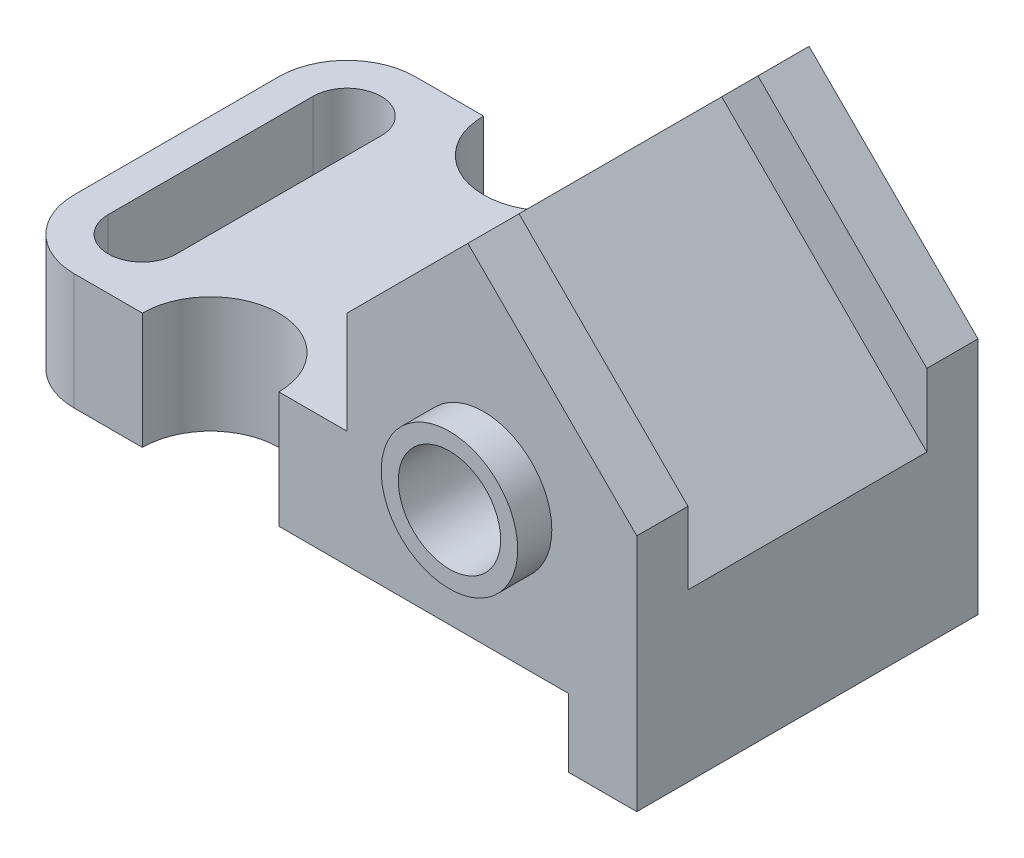
ISO-10303-21;
HEADER;
FILE_DESCRIPTION(('STEP AP214'),'2;1');
FILE_NAME('part.step','',(''),(''),'','','');
FILE_SCHEMA(('AUTOMOTIVE_DESIGN { 1 0 10303 214 1 1 1 1 }'));
ENDSEC;
DATA;
#1=APPLICATION_CONTEXT('core data for automotive mechanical design processes');
#2=APPLICATION_PROTOCOL_DEFINITION('international standard','automotive_design',2000,#1);
#3=PRODUCT_CONTEXT('',#1,'mechanical');
#4=PRODUCT('Part','Part','',(#3));
#5=PRODUCT_RELATED_PRODUCT_CATEGORY('part','',(#4));
#6=PRODUCT_DEFINITION_FORMATION('','',#4);
#7=PRODUCT_DEFINITION_CONTEXT('part definition',#1,'design');
#8=PRODUCT_DEFINITION('design','',#6,#7);
#9=PRODUCT_DEFINITION_SHAPE('','',#8);
#10=(LENGTH_UNIT() NAMED_UNIT(*) SI_UNIT(.MILLI.,.METRE.));
#11=(NAMED_UNIT(*) PLANE_ANGLE_UNIT() SI_UNIT($,.RADIAN.));
#12=(NAMED_UNIT(*) SI_UNIT($,.STERADIAN.) SOLID_ANGLE_UNIT());
#13=UNCERTAINTY_MEASURE_WITH_UNIT(LENGTH_MEASURE(1.E-05),#10,'distance_accuracy_value','');
#14=(GEOMETRIC_REPRESENTATION_CONTEXT(3) GLOBAL_UNCERTAINTY_ASSIGNED_CONTEXT((#13)) GLOBAL_UNIT_ASSIGNED_CONTEXT((#10,
#11,#12)) REPRESENTATION_CONTEXT('',''));
#15=CARTESIAN_POINT('',(0.,0.,0.));
#16=DIRECTION('',(0.,0.,1.));
#17=DIRECTION('',(1.,0.,0.));
#18=AXIS2_PLACEMENT_3D('',#15,#16,#17);
#19=CARTESIAN_POINT('',(0.,0.,100.));
#20=DIRECTION('',(0.,0.,1.));
#21=DIRECTION('',(1.,0.,0.));
#22=AXIS2_PLACEMENT_3D('',#19,#20,#21);
#23=PLANE('',#22);
#24=CARTESIAN_POINT('',(140.,39.1,100.));
#25=DIRECTION('',(0.,0.,1.));
#26=DIRECTION('',(1.,0.,0.));
#27=AXIS2_PLACEMENT_3D('',#24,#25,#26);
#28=CIRCLE('',#27,20.);
#29=CARTESIAN_POINT('',(160.,39.1,100.));
#30=VERTEX_POINT('',#29);
#31=EDGE_CURVE('E611',#30,#30,#28,.T.);
#32=ORIENTED_EDGE('',*,*,#31,.F.);
#33=EDGE_LOOP('',(#32));
#34=FACE_BOUND('',#33,.T.);
#35=DIRECTION('',(0.,1.,0.));
#36=VECTOR('',#35,1.);
#37=CARTESIAN_POINT('',(80.,-20.,100.));
#38=LINE('',#37,#36);
#39=CARTESIAN_POINT('',(80.,0.,100.));
#40=VERTEX_POINT('',#39);
#41=CARTESIAN_POINT('',(80.,34.1,100.));
#42=VERTEX_POINT('',#41);
#43=EDGE_CURVE('E407',#40,#42,#38,.T.);
#44=ORIENTED_EDGE('',*,*,#43,.F.);
#45=DIRECTION('',(1.,0.,0.));
#46=VECTOR('',#45,1.);
#47=CARTESIAN_POINT('',(0.,0.,100.));
#48=LINE('',#47,#46);
#49=CARTESIAN_POINT('',(164.9,0.,100.));
#50=VERTEX_POINT('',#49);
#51=EDGE_CURVE('E288',#40,#50,#48,.T.);
#52=ORIENTED_EDGE('',*,*,#51,.T.);
#53=DIRECTION('',(0.,-1.,0.));
#54=VECTOR('',#53,1.);
#55=CARTESIAN_POINT('',(164.9,0.,100.));
#56=LINE('',#55,#54);
#57=CARTESIAN_POINT('',(164.9,-20.,100.));
#58=VERTEX_POINT('',#57);
#59=EDGE_CURVE('E293',#50,#58,#56,.T.);
#60=ORIENTED_EDGE('',*,*,#59,.T.);
#61=DIRECTION('',(-1.,0.,0.));
#62=VECTOR('',#61,1.);
#63=CARTESIAN_POINT('',(0.,-20.,100.));
#64=LINE('',#63,#62);
#65=CARTESIAN_POINT('',(184.9,-20.,100.));
#66=VERTEX_POINT('',#65);
#67=EDGE_CURVE('E296',#66,#58,#64,.T.);
#68=ORIENTED_EDGE('',*,*,#67,.F.);
#69=DIRECTION('',(0.,1.,0.));
#70=VECTOR('',#69,1.);
#71=CARTESIAN_POINT('',(184.9,0.,100.));
#72=LINE('',#71,#70);
#73=CARTESIAN_POINT('',(184.9,50.,100.));
#74=VERTEX_POINT('',#73);
#75=EDGE_CURVE('E300',#66,#74,#72,.T.);
#76=ORIENTED_EDGE('',*,*,#75,.T.);
#77=DIRECTION('',(-0.70710678118655,0.707106781186546,0.));
#78=VECTOR('',#77,1.);
#79=CARTESIAN_POINT('',(117.45,117.45,100.));
#80=LINE('',#79,#78);
#81=CARTESIAN_POINT('',(135.4,99.5000000000001,100.));
#82=VERTEX_POINT('',#81);
#83=EDGE_CURVE('E304',#74,#82,#80,.T.);
#84=ORIENTED_EDGE('',*,*,#83,.T.);
#85=DIRECTION('',(-0.707106781186543,-0.707106781186552,0.));
#86=VECTOR('',#85,1.);
#87=CARTESIAN_POINT('',(17.9500000000006,-17.9500000000004,100.));
#88=LINE('',#87,#86);
#89=CARTESIAN_POINT('',(100.,64.1,100.));
#90=VERTEX_POINT('',#89);
#91=EDGE_CURVE('E308',#82,#90,#88,.T.);
#92=ORIENTED_EDGE('',*,*,#91,.T.);
#93=DIRECTION('',(0.,1.,0.));
#94=VECTOR('',#93,1.);
#95=CARTESIAN_POINT('',(100.,0.,100.));
#96=LINE('',#95,#94);
#97=CARTESIAN_POINT('',(100.,34.1,100.));
#98=VERTEX_POINT('',#97);
#99=EDGE_CURVE('E311',#98,#90,#96,.T.);
#100=ORIENTED_EDGE('',*,*,#99,.F.);
#101=DIRECTION('',(1.,0.,0.));
#102=VECTOR('',#101,1.);
#103=CARTESIAN_POINT('',(0.,34.1,100.));
#104=LINE('',#103,#102);
#105=EDGE_CURVE('E289',#42,#98,#104,.T.);
#106=ORIENTED_EDGE('',*,*,#105,.F.);
#107=EDGE_LOOP('',(#44,#52,#60,#68,#76,#84,#92,#100,#106));
#108=FACE_BOUND('',#107,.T.);
#109=ADVANCED_FACE('F47',(#34,#108),#23,.T.);
#110=CARTESIAN_POINT('',(0.,0.,0.));
#111=DIRECTION('',(0.,0.,1.));
#112=DIRECTION('',(1.,0.,0.));
#113=AXIS2_PLACEMENT_3D('',#110,#111,#112);
#114=PLANE('',#113);
#115=CARTESIAN_POINT('',(140.,39.1,0.));
#116=DIRECTION('',(0.,0.,1.));
#117=DIRECTION('',(1.,0.,0.));
#118=AXIS2_PLACEMENT_3D('',#115,#116,#117);
#119=CIRCLE('',#118,15.);
#120=CARTESIAN_POINT('',(155.,39.1,0.));
#121=VERTEX_POINT('',#120);
#122=EDGE_CURVE('E284',#121,#121,#119,.T.);
#123=ORIENTED_EDGE('',*,*,#122,.T.);
#124=EDGE_LOOP('',(#123));
#125=FACE_BOUND('',#124,.T.);
#126=DIRECTION('',(1.,0.,0.));
#127=VECTOR('',#126,1.);
#128=CARTESIAN_POINT('',(0.,0.,0.));
#129=LINE('',#128,#127);
#130=CARTESIAN_POINT('',(80.,0.,0.));
#131=VERTEX_POINT('',#130);
#132=CARTESIAN_POINT('',(164.9,0.,0.));
#133=VERTEX_POINT('',#132);
#134=EDGE_CURVE('E323',#131,#133,#129,.T.);
#135=ORIENTED_EDGE('',*,*,#134,.F.);
#136=DIRECTION('',(0.,1.,0.));
#137=VECTOR('',#136,1.);
#138=CARTESIAN_POINT('',(80.,-20.,0.));
#139=LINE('',#138,#137);
#140=CARTESIAN_POINT('',(80.,34.1,0.));
#141=VERTEX_POINT('',#140);
#142=EDGE_CURVE('E399',#131,#141,#139,.T.);
#143=ORIENTED_EDGE('',*,*,#142,.T.);
#144=DIRECTION('',(1.,0.,0.));
#145=VECTOR('',#144,1.);
#146=CARTESIAN_POINT('',(0.,34.1,0.));
#147=LINE('',#146,#145);
#148=CARTESIAN_POINT('',(100.,34.1,0.));
#149=VERTEX_POINT('',#148);
#150=EDGE_CURVE('E319',#141,#149,#147,.T.);
#151=ORIENTED_EDGE('',*,*,#150,.T.);
#152=DIRECTION('',(0.,1.,0.));
#153=VECTOR('',#152,1.);
#154=CARTESIAN_POINT('',(100.,0.,0.));
#155=LINE('',#154,#153);
#156=CARTESIAN_POINT('',(100.,64.1,0.));
#157=VERTEX_POINT('',#156);
#158=EDGE_CURVE('E347',#149,#157,#155,.T.);
#159=ORIENTED_EDGE('',*,*,#158,.T.);
#160=DIRECTION('',(-0.707106781186543,-0.707106781186552,0.));
#161=VECTOR('',#160,1.);
#162=CARTESIAN_POINT('',(17.9500000000006,-17.9500000000004,0.));
#163=LINE('',#162,#161);
#164=CARTESIAN_POINT('',(135.4,99.5000000000001,0.));
#165=VERTEX_POINT('',#164);
#166=EDGE_CURVE('E343',#165,#157,#163,.T.);
#167=ORIENTED_EDGE('',*,*,#166,.F.);
#168=DIRECTION('',(-0.70710678118655,0.707106781186546,0.));
#169=VECTOR('',#168,1.);
#170=CARTESIAN_POINT('',(117.45,117.45,0.));
#171=LINE('',#170,#169);
#172=CARTESIAN_POINT('',(184.9,50.,0.));
#173=VERTEX_POINT('',#172);
#174=EDGE_CURVE('E339',#173,#165,#171,.T.);
#175=ORIENTED_EDGE('',*,*,#174,.F.);
#176=DIRECTION('',(0.,1.,0.));
#177=VECTOR('',#176,1.);
#178=CARTESIAN_POINT('',(184.9,0.,0.));
#179=LINE('',#178,#177);
#180=CARTESIAN_POINT('',(184.9,-20.,0.));
#181=VERTEX_POINT('',#180);
#182=EDGE_CURVE('E335',#181,#173,#179,.T.);
#183=ORIENTED_EDGE('',*,*,#182,.F.);
#184=DIRECTION('',(-1.,0.,0.));
#185=VECTOR('',#184,1.);
#186=CARTESIAN_POINT('',(0.,-20.,0.));
#187=LINE('',#186,#185);
#188=CARTESIAN_POINT('',(164.9,-20.,0.));
#189=VERTEX_POINT('',#188);
#190=EDGE_CURVE('E331',#181,#189,#187,.T.);
#191=ORIENTED_EDGE('',*,*,#190,.T.);
#192=DIRECTION('',(0.,-1.,0.));
#193=VECTOR('',#192,1.);
#194=CARTESIAN_POINT('',(164.9,0.,0.));
#195=LINE('',#194,#193);
#196=EDGE_CURVE('E327',#133,#189,#195,.T.);
#197=ORIENTED_EDGE('',*,*,#196,.F.);
#198=EDGE_LOOP('',(#135,#143,#151,#159,#167,#175,#183,#191,#197));
#199=FACE_BOUND('',#198,.T.);
#200=ADVANCED_FACE('F468',(#125,#199),#114,.F.);
#201=CARTESIAN_POINT('',(117.45,117.45,100.));
#202=DIRECTION('',(-0.707106781186546,-0.70710678118655,0.));
#203=DIRECTION('',(0.70710678118655,-0.707106781186546,0.));
#204=AXIS2_PLACEMENT_3D('',#201,#202,#203);
#205=PLANE('',#204);
#206=DIRECTION('',(0.,0.,-1.));
#207=VECTOR('',#206,1.);
#208=CARTESIAN_POINT('',(184.9,50.,100.));
#209=LINE('',#208,#207);
#210=CARTESIAN_POINT('',(184.9,50.0000000000002,85.));
#211=VERTEX_POINT('',#210);
#212=EDGE_CURVE('E363',#74,#211,#209,.T.);
#213=ORIENTED_EDGE('',*,*,#212,.T.);
#214=DIRECTION('',(-0.707106781186552,0.707106781186543,0.));
#215=VECTOR('',#214,1.);
#216=CARTESIAN_POINT('',(219.9,15.0000000000006,85.));
#217=LINE('',#216,#215);
#218=CARTESIAN_POINT('',(135.4,99.5000000000001,85.));
#219=VERTEX_POINT('',#218);
#220=EDGE_CURVE('E259',#211,#219,#217,.T.);
#221=ORIENTED_EDGE('',*,*,#220,.T.);
#222=DIRECTION('',(0.,0.,-1.));
#223=VECTOR('',#222,1.);
#224=CARTESIAN_POINT('',(135.4,99.5000000000001,100.));
#225=LINE('',#224,#223);
#226=EDGE_CURVE('E358',#82,#219,#225,.T.);
#227=ORIENTED_EDGE('',*,*,#226,.F.);
#228=ORIENTED_EDGE('',*,*,#83,.F.);
#229=EDGE_LOOP('',(#213,#221,#227,#228));
#230=FACE_BOUND('',#229,.T.);
#231=ADVANCED_FACE('F525',(#230),#205,.F.);
#232=CARTESIAN_POINT('',(0.,34.1,100.));
#233=DIRECTION('',(0.,1.,0.));
#234=DIRECTION('',(0.,0.,1.));
#235=AXIS2_PLACEMENT_3D('',#232,#233,#234);
#236=PLANE('',#235);
#237=DIRECTION('',(0.,0.,1.));
#238=VECTOR('',#237,1.);
#239=CARTESIAN_POINT('',(10.,34.1,100.));
#240=LINE('',#239,#238);
#241=CARTESIAN_POINT('',(10.,34.1,20.));
#242=VERTEX_POINT('',#241);
#243=CARTESIAN_POINT('',(10.,34.1,80.));
#244=VERTEX_POINT('',#243);
#245=EDGE_CURVE('E237',#242,#244,#240,.T.);
#246=ORIENTED_EDGE('',*,*,#245,.F.);
#247=CARTESIAN_POINT('',(20.,34.1,20.));
#248=DIRECTION('',(0.,1.,0.));
#249=DIRECTION('',(0.,0.,1.));
#250=AXIS2_PLACEMENT_3D('',#247,#248,#249);
#251=CIRCLE('',#250,10.);
#252=CARTESIAN_POINT('',(30.,34.1,20.));
#253=VERTEX_POINT('',#252);
#254=EDGE_CURVE('E233',#253,#242,#251,.T.);
#255=ORIENTED_EDGE('',*,*,#254,.F.);
#256=DIRECTION('',(0.,0.,1.));
#257=VECTOR('',#256,1.);
#258=CARTESIAN_POINT('',(30.,34.1,100.));
#259=LINE('',#258,#257);
#260=CARTESIAN_POINT('',(30.,34.1,80.));
#261=VERTEX_POINT('',#260);
#262=EDGE_CURVE('E217',#253,#261,#259,.T.);
#263=ORIENTED_EDGE('',*,*,#262,.T.);
#264=CARTESIAN_POINT('',(20.,34.1,80.));
#265=DIRECTION('',(0.,1.,0.));
#266=DIRECTION('',(0.,0.,1.));
#267=AXIS2_PLACEMENT_3D('',#264,#265,#266);
#268=CIRCLE('',#267,10.);
#269=EDGE_CURVE('E205',#244,#261,#268,.T.);
#270=ORIENTED_EDGE('',*,*,#269,.F.);
#271=EDGE_LOOP('',(#246,#255,#263,#270));
#272=FACE_BOUND('',#271,.T.);
#273=DIRECTION('',(0.,0.,-1.));
#274=VECTOR('',#273,1.);
#275=CARTESIAN_POINT('',(0.,34.1,100.));
#276=LINE('',#275,#274);
#277=CARTESIAN_POINT('',(0.,34.1,80.));
#278=VERTEX_POINT('',#277);
#279=CARTESIAN_POINT('',(0.,34.1,20.));
#280=VERTEX_POINT('',#279);
#281=EDGE_CURVE('E380',#278,#280,#276,.T.);
#282=ORIENTED_EDGE('',*,*,#281,.F.);
#283=CARTESIAN_POINT('',(20.,34.1,80.));
#284=DIRECTION('',(0.,1.,0.));
#285=DIRECTION('',(0.,0.,1.));
#286=AXIS2_PLACEMENT_3D('',#283,#284,#285);
#287=CIRCLE('',#286,20.);
#288=CARTESIAN_POINT('',(20.,34.1,100.));
#289=VERTEX_POINT('',#288);
#290=EDGE_CURVE('E433',#278,#289,#287,.T.);
#291=ORIENTED_EDGE('',*,*,#290,.T.);
#292=CARTESIAN_POINT('',(40.,34.1,100.));
#293=VERTEX_POINT('',#292);
#294=EDGE_CURVE('E285',#289,#293,#104,.T.);
#295=ORIENTED_EDGE('',*,*,#294,.T.);
#296=CARTESIAN_POINT('',(60.,34.1,100.));
#297=DIRECTION('',(0.,1.,0.));
#298=DIRECTION('',(0.,0.,1.));
#299=AXIS2_PLACEMENT_3D('',#296,#297,#298);
#300=CIRCLE('',#299,20.);
#301=EDGE_CURVE('E254',#42,#293,#300,.T.);
#302=ORIENTED_EDGE('',*,*,#301,.F.);
#303=ORIENTED_EDGE('',*,*,#105,.T.);
#304=DIRECTION('',(0.,0.,-1.));
#305=VECTOR('',#304,1.);
#306=CARTESIAN_POINT('',(100.,34.1,100.));
#307=LINE('',#306,#305);
#308=EDGE_CURVE('E315',#98,#149,#307,.T.);
#309=ORIENTED_EDGE('',*,*,#308,.T.);
#310=ORIENTED_EDGE('',*,*,#150,.F.);
#311=CARTESIAN_POINT('',(60.,34.1,0.));
#312=DIRECTION('',(0.,1.,0.));
#313=DIRECTION('',(0.,0.,1.));
#314=AXIS2_PLACEMENT_3D('',#311,#312,#313);
#315=CIRCLE('',#314,20.);
#316=CARTESIAN_POINT('',(40.,34.1,0.));
#317=VERTEX_POINT('',#316);
#318=EDGE_CURVE('E247',#317,#141,#315,.T.);
#319=ORIENTED_EDGE('',*,*,#318,.F.);
#320=CARTESIAN_POINT('',(20.,34.1,0.));
#321=VERTEX_POINT('',#320);
#322=EDGE_CURVE('E320',#321,#317,#147,.T.);
#323=ORIENTED_EDGE('',*,*,#322,.F.);
#324=CARTESIAN_POINT('',(20.,34.1,20.));
#325=DIRECTION('',(0.,1.,0.));
#326=DIRECTION('',(0.,0.,1.));
#327=AXIS2_PLACEMENT_3D('',#324,#325,#326);
#328=CIRCLE('',#327,20.);
#329=EDGE_CURVE('E430',#321,#280,#328,.T.);
#330=ORIENTED_EDGE('',*,*,#329,.T.);
#331=EDGE_LOOP('',(#282,#291,#295,#302,#303,#309,#310,#319,#323,#330));
#332=FACE_BOUND('',#331,.T.);
#333=ADVANCED_FACE('F231',(#272,#332),#236,.T.);
#334=CARTESIAN_POINT('',(0.,0.,100.));
#335=DIRECTION('',(-1.,0.,0.));
#336=DIRECTION('',(0.,0.,1.));
#337=AXIS2_PLACEMENT_3D('',#334,#335,#336);
#338=PLANE('',#337);
#339=DIRECTION('',(0.,0.,-1.));
#340=VECTOR('',#339,1.);
#341=CARTESIAN_POINT('',(0.,0.,100.));
#342=LINE('',#341,#340);
#343=CARTESIAN_POINT('',(0.,0.,80.));
#344=VERTEX_POINT('',#343);
#345=CARTESIAN_POINT('',(0.,0.,20.));
#346=VERTEX_POINT('',#345);
#347=EDGE_CURVE('E377',#344,#346,#342,.T.);
#348=ORIENTED_EDGE('',*,*,#347,.F.);
#349=DIRECTION('',(0.,1.,0.));
#350=VECTOR('',#349,1.);
#351=CARTESIAN_POINT('',(0.,0.,80.));
#352=LINE('',#351,#350);
#353=EDGE_CURVE('E426',#344,#278,#352,.T.);
#354=ORIENTED_EDGE('',*,*,#353,.T.);
#355=ORIENTED_EDGE('',*,*,#281,.T.);
#356=DIRECTION('',(0.,1.,0.));
#357=VECTOR('',#356,1.);
#358=CARTESIAN_POINT('',(0.,0.,20.));
#359=LINE('',#358,#357);
#360=EDGE_CURVE('E423',#280,#346,#359,.F.);
#361=ORIENTED_EDGE('',*,*,#360,.T.);
#362=EDGE_LOOP('',(#348,#354,#355,#361));
#363=FACE_BOUND('',#362,.T.);
#364=ADVANCED_FACE('F447',(#363),#338,.T.);
#365=CARTESIAN_POINT('',(0.,0.,100.));
#366=DIRECTION('',(0.,1.,0.));
#367=DIRECTION('',(0.,0.,1.));
#368=AXIS2_PLACEMENT_3D('',#365,#366,#367);
#369=PLANE('',#368);
#370=CARTESIAN_POINT('',(20.,0.,20.));
#371=DIRECTION('',(0.,1.,0.));
#372=DIRECTION('',(0.,0.,1.));
#373=AXIS2_PLACEMENT_3D('',#370,#371,#372);
#374=CIRCLE('',#373,10.);
#375=CARTESIAN_POINT('',(30.,0.,20.));
#376=VERTEX_POINT('',#375);
#377=CARTESIAN_POINT('',(10.,0.,20.));
#378=VERTEX_POINT('',#377);
#379=EDGE_CURVE('E415',#376,#378,#374,.T.);
#380=ORIENTED_EDGE('',*,*,#379,.T.);
#381=DIRECTION('',(0.,0.,1.));
#382=VECTOR('',#381,1.);
#383=CARTESIAN_POINT('',(10.,0.,100.));
#384=LINE('',#383,#382);
#385=CARTESIAN_POINT('',(10.,0.,80.));
#386=VERTEX_POINT('',#385);
#387=EDGE_CURVE('E419',#378,#386,#384,.T.);
#388=ORIENTED_EDGE('',*,*,#387,.T.);
#389=CARTESIAN_POINT('',(20.,0.,80.));
#390=DIRECTION('',(0.,1.,0.));
#391=DIRECTION('',(0.,0.,1.));
#392=AXIS2_PLACEMENT_3D('',#389,#390,#391);
#393=CIRCLE('',#392,10.);
#394=CARTESIAN_POINT('',(30.,0.,80.));
#395=VERTEX_POINT('',#394);
#396=EDGE_CURVE('E410',#386,#395,#393,.T.);
#397=ORIENTED_EDGE('',*,*,#396,.T.);
#398=DIRECTION('',(0.,0.,1.));
#399=VECTOR('',#398,1.);
#400=CARTESIAN_POINT('',(30.,0.,100.));
#401=LINE('',#400,#399);
#402=EDGE_CURVE('E225',#376,#395,#401,.T.);
#403=ORIENTED_EDGE('',*,*,#402,.F.);
#404=EDGE_LOOP('',(#380,#388,#397,#403));
#405=FACE_BOUND('',#404,.T.);
#406=CARTESIAN_POINT('',(20.,0.,100.));
#407=VERTEX_POINT('',#406);
#408=CARTESIAN_POINT('',(40.,0.,100.));
#409=VERTEX_POINT('',#408);
#410=EDGE_CURVE('E290',#407,#409,#48,.T.);
#411=ORIENTED_EDGE('',*,*,#410,.F.);
#412=CARTESIAN_POINT('',(20.,0.,80.));
#413=DIRECTION('',(0.,1.,0.));
#414=DIRECTION('',(0.,0.,1.));
#415=AXIS2_PLACEMENT_3D('',#412,#413,#414);
#416=CIRCLE('',#415,20.);
#417=EDGE_CURVE('E57',#407,#344,#416,.F.);
#418=ORIENTED_EDGE('',*,*,#417,.T.);
#419=ORIENTED_EDGE('',*,*,#347,.T.);
#420=CARTESIAN_POINT('',(20.,0.,20.));
#421=DIRECTION('',(0.,1.,0.));
#422=DIRECTION('',(0.,0.,1.));
#423=AXIS2_PLACEMENT_3D('',#420,#421,#422);
#424=CIRCLE('',#423,20.);
#425=CARTESIAN_POINT('',(20.,0.,0.));
#426=VERTEX_POINT('',#425);
#427=EDGE_CURVE('E64',#346,#426,#424,.F.);
#428=ORIENTED_EDGE('',*,*,#427,.T.);
#429=CARTESIAN_POINT('',(40.,0.,0.));
#430=VERTEX_POINT('',#429);
#431=EDGE_CURVE('E324',#426,#430,#129,.T.);
#432=ORIENTED_EDGE('',*,*,#431,.T.);
#433=CARTESIAN_POINT('',(60.,0.,0.));
#434=DIRECTION('',(0.,1.,0.));
#435=DIRECTION('',(0.,0.,1.));
#436=AXIS2_PLACEMENT_3D('',#433,#434,#435);
#437=CIRCLE('',#436,20.);
#438=EDGE_CURVE('E243',#430,#131,#437,.T.);
#439=ORIENTED_EDGE('',*,*,#438,.T.);
#440=ORIENTED_EDGE('',*,*,#134,.T.);
#441=DIRECTION('',(0.,0.,-1.));
#442=VECTOR('',#441,1.);
#443=CARTESIAN_POINT('',(164.9,0.,100.));
#444=LINE('',#443,#442);
#445=EDGE_CURVE('E373',#50,#133,#444,.T.);
#446=ORIENTED_EDGE('',*,*,#445,.F.);
#447=ORIENTED_EDGE('',*,*,#51,.F.);
#448=CARTESIAN_POINT('',(60.,0.,100.));
#449=DIRECTION('',(0.,1.,0.));
#450=DIRECTION('',(0.,0.,1.));
#451=AXIS2_PLACEMENT_3D('',#448,#449,#450);
#452=CIRCLE('',#451,20.);
#453=EDGE_CURVE('E250',#40,#409,#452,.T.);
#454=ORIENTED_EDGE('',*,*,#453,.T.);
#455=EDGE_LOOP('',(#411,#418,#419,#428,#432,#439,#440,#446,#447,#454));
#456=FACE_BOUND('',#455,.T.);
#457=ADVANCED_FACE('F443',(#405,#456),#369,.F.);
#458=CARTESIAN_POINT('',(164.9,0.,100.));
#459=DIRECTION('',(1.,0.,0.));
#460=DIRECTION('',(0.,0.,-1.));
#461=AXIS2_PLACEMENT_3D('',#458,#459,#460);
#462=PLANE('',#461);
#463=ORIENTED_EDGE('',*,*,#196,.T.);
#464=DIRECTION('',(0.,0.,-1.));
#465=VECTOR('',#464,1.);
#466=CARTESIAN_POINT('',(164.9,-20.,100.));
#467=LINE('',#466,#465);
#468=EDGE_CURVE('E370',#58,#189,#467,.T.);
#469=ORIENTED_EDGE('',*,*,#468,.F.);
#470=ORIENTED_EDGE('',*,*,#59,.F.);
#471=ORIENTED_EDGE('',*,*,#445,.T.);
#472=EDGE_LOOP('',(#463,#469,#470,#471));
#473=FACE_BOUND('',#472,.T.);
#474=ADVANCED_FACE('F500',(#473),#462,.F.);
#475=CARTESIAN_POINT('',(0.,-20.,100.));
#476=DIRECTION('',(0.,-1.,0.));
#477=DIRECTION('',(1.,0.,0.));
#478=AXIS2_PLACEMENT_3D('',#475,#476,#477);
#479=PLANE('',#478);
#480=ORIENTED_EDGE('',*,*,#190,.F.);
#481=DIRECTION('',(0.,0.,-1.));
#482=VECTOR('',#481,1.);
#483=CARTESIAN_POINT('',(184.9,-20.,100.));
#484=LINE('',#483,#482);
#485=EDGE_CURVE('E367',#66,#181,#484,.T.);
#486=ORIENTED_EDGE('',*,*,#485,.F.);
#487=ORIENTED_EDGE('',*,*,#67,.T.);
#488=ORIENTED_EDGE('',*,*,#468,.T.);
#489=EDGE_LOOP('',(#480,#486,#487,#488));
#490=FACE_BOUND('',#489,.T.);
#491=ADVANCED_FACE('F496',(#490),#479,.T.);
#492=CARTESIAN_POINT('',(184.9,0.,100.));
#493=DIRECTION('',(-1.,0.,0.));
#494=DIRECTION('',(0.,0.,1.));
#495=AXIS2_PLACEMENT_3D('',#492,#493,#494);
#496=PLANE('',#495);
#497=DIRECTION('',(0.,0.,-1.));
#498=VECTOR('',#497,1.);
#499=CARTESIAN_POINT('',(184.9,28.7867965644041,100.));
#500=LINE('',#499,#498);
#501=CARTESIAN_POINT('',(184.9,28.7867965644041,85.));
#502=VERTEX_POINT('',#501);
#503=CARTESIAN_POINT('',(184.9,28.7867965644041,15.));
#504=VERTEX_POINT('',#503);
#505=EDGE_CURVE('E277',#502,#504,#500,.T.);
#506=ORIENTED_EDGE('',*,*,#505,.F.);
#507=DIRECTION('',(0.,1.,0.));
#508=VECTOR('',#507,1.);
#509=CARTESIAN_POINT('',(184.9,0.,85.));
#510=LINE('',#509,#508);
#511=EDGE_CURVE('E280',#502,#211,#510,.T.);
#512=ORIENTED_EDGE('',*,*,#511,.T.);
#513=ORIENTED_EDGE('',*,*,#212,.F.);
#514=ORIENTED_EDGE('',*,*,#75,.F.);
#515=ORIENTED_EDGE('',*,*,#485,.T.);
#516=ORIENTED_EDGE('',*,*,#182,.T.);
#517=CARTESIAN_POINT('',(184.9,50.0000000000002,15.));
#518=VERTEX_POINT('',#517);
#519=EDGE_CURVE('E362',#518,#173,#209,.T.);
#520=ORIENTED_EDGE('',*,*,#519,.F.);
#521=DIRECTION('',(0.,-1.,0.));
#522=VECTOR('',#521,1.);
#523=CARTESIAN_POINT('',(184.9,0.,15.));
#524=LINE('',#523,#522);
#525=EDGE_CURVE('E263',#518,#504,#524,.T.);
#526=ORIENTED_EDGE('',*,*,#525,.T.);
#527=EDGE_LOOP('',(#506,#512,#513,#514,#515,#516,#520,#526));
#528=FACE_BOUND('',#527,.T.);
#529=ADVANCED_FACE('F491',(#528),#496,.F.);
#530=CARTESIAN_POINT('',(135.4,99.5000000000001,15.));
#531=VERTEX_POINT('',#530);
#532=EDGE_CURVE('E357',#531,#165,#225,.T.);
#533=ORIENTED_EDGE('',*,*,#532,.F.);
#534=DIRECTION('',(-0.707106781186552,0.707106781186543,0.));
#535=VECTOR('',#534,1.);
#536=CARTESIAN_POINT('',(219.9,15.0000000000006,15.));
#537=LINE('',#536,#535);
#538=EDGE_CURVE('E258',#518,#531,#537,.T.);
#539=ORIENTED_EDGE('',*,*,#538,.F.);
#540=ORIENTED_EDGE('',*,*,#519,.T.);
#541=ORIENTED_EDGE('',*,*,#174,.T.);
#542=EDGE_LOOP('',(#533,#539,#540,#541));
#543=FACE_BOUND('',#542,.T.);
#544=ADVANCED_FACE('F484',(#543),#205,.F.);
#545=CARTESIAN_POINT('',(17.9500000000006,-17.9500000000004,100.));
#546=DIRECTION('',(0.707106781186552,-0.707106781186543,0.));
#547=DIRECTION('',(0.707106781186543,0.707106781186552,0.));
#548=AXIS2_PLACEMENT_3D('',#545,#546,#547);
#549=PLANE('',#548);
#550=ORIENTED_EDGE('',*,*,#226,.T.);
#551=DIRECTION('',(-0.707106781186543,-0.707106781186552,0.));
#552=VECTOR('',#551,1.);
#553=CARTESIAN_POINT('',(17.9500000000006,-17.9500000000004,85.));
#554=LINE('',#553,#552);
#555=CARTESIAN_POINT('',(124.793398282202,88.8933982822018,85.));
#556=VERTEX_POINT('',#555);
#557=EDGE_CURVE('E391',#219,#556,#554,.T.);
#558=ORIENTED_EDGE('',*,*,#557,.T.);
#559=DIRECTION('',(0.,0.,1.));
#560=VECTOR('',#559,1.);
#561=CARTESIAN_POINT('',(124.793398282202,88.8933982822018,100.));
#562=LINE('',#561,#560);
#563=CARTESIAN_POINT('',(124.793398282202,88.8933982822018,15.));
#564=VERTEX_POINT('',#563);
#565=EDGE_CURVE('E388',#564,#556,#562,.T.);
#566=ORIENTED_EDGE('',*,*,#565,.F.);
#567=DIRECTION('',(0.707106781186543,0.707106781186552,0.));
#568=VECTOR('',#567,1.);
#569=CARTESIAN_POINT('',(17.9500000000006,-17.9500000000004,15.));
#570=LINE('',#569,#568);
#571=EDGE_CURVE('E384',#564,#531,#570,.T.);
#572=ORIENTED_EDGE('',*,*,#571,.T.);
#573=ORIENTED_EDGE('',*,*,#532,.T.);
#574=ORIENTED_EDGE('',*,*,#166,.T.);
#575=DIRECTION('',(0.,0.,-1.));
#576=VECTOR('',#575,1.);
#577=CARTESIAN_POINT('',(100.,64.1,100.));
#578=LINE('',#577,#576);
#579=EDGE_CURVE('E354',#90,#157,#578,.T.);
#580=ORIENTED_EDGE('',*,*,#579,.F.);
#581=ORIENTED_EDGE('',*,*,#91,.F.);
#582=EDGE_LOOP('',(#550,#558,#566,#572,#573,#574,#580,#581));
#583=FACE_BOUND('',#582,.T.);
#584=ADVANCED_FACE('F479',(#583),#549,.F.);
#585=CARTESIAN_POINT('',(140.,39.1,100.));
#586=DIRECTION('',(0.,0.,-1.));
#587=DIRECTION('',(-1.,0.,0.));
#588=AXIS2_PLACEMENT_3D('',#585,#586,#587);
#589=CYLINDRICAL_SURFACE('',#588,15.);
#590=ORIENTED_EDGE('',*,*,#122,.F.);
#591=EDGE_LOOP('',(#590));
#592=FACE_BOUND('',#591,.T.);
#593=CARTESIAN_POINT('',(140.,39.1,110.));
#594=DIRECTION('',(0.,0.,1.));
#595=DIRECTION('',(1.,0.,0.));
#596=AXIS2_PLACEMENT_3D('',#593,#594,#595);
#597=CIRCLE('',#596,15.);
#598=CARTESIAN_POINT('',(155.,39.1,110.));
#599=VERTEX_POINT('',#598);
#600=EDGE_CURVE('E51',#599,#599,#597,.T.);
#601=ORIENTED_EDGE('',*,*,#600,.T.);
#602=EDGE_LOOP('',(#601));
#603=FACE_BOUND('',#602,.T.);
#604=ADVANCED_FACE('F537',(#592,#603),#589,.F.);
#605=CARTESIAN_POINT('',(100.,0.,100.));
#606=DIRECTION('',(-1.,0.,0.));
#607=DIRECTION('',(0.,0.,1.));
#608=AXIS2_PLACEMENT_3D('',#605,#606,#607);
#609=PLANE('',#608);
#610=ORIENTED_EDGE('',*,*,#158,.F.);
#611=ORIENTED_EDGE('',*,*,#308,.F.);
#612=ORIENTED_EDGE('',*,*,#99,.T.);
#613=ORIENTED_EDGE('',*,*,#579,.T.);
#614=EDGE_LOOP('',(#610,#611,#612,#613));
#615=FACE_BOUND('',#614,.T.);
#616=ADVANCED_FACE('F476',(#615),#609,.T.);
#617=ORIENTED_EDGE('',*,*,#294,.F.);
#618=DIRECTION('',(0.,1.,0.));
#619=VECTOR('',#618,1.);
#620=CARTESIAN_POINT('',(20.,0.,100.));
#621=LINE('',#620,#619);
#622=EDGE_CURVE('E72',#289,#407,#621,.F.);
#623=ORIENTED_EDGE('',*,*,#622,.T.);
#624=ORIENTED_EDGE('',*,*,#410,.T.);
#625=DIRECTION('',(0.,1.,0.));
#626=VECTOR('',#625,1.);
#627=CARTESIAN_POINT('',(40.,-20.,100.));
#628=LINE('',#627,#626);
#629=EDGE_CURVE('E403',#293,#409,#628,.F.);
#630=ORIENTED_EDGE('',*,*,#629,.F.);
#631=EDGE_LOOP('',(#617,#623,#624,#630));
#632=FACE_BOUND('',#631,.T.);
#633=ADVANCED_FACE('F453',(#632),#23,.T.);
#634=ORIENTED_EDGE('',*,*,#431,.F.);
#635=DIRECTION('',(0.,1.,0.));
#636=VECTOR('',#635,1.);
#637=CARTESIAN_POINT('',(20.,34.1,0.));
#638=LINE('',#637,#636);
#639=EDGE_CURVE('E11',#426,#321,#638,.T.);
#640=ORIENTED_EDGE('',*,*,#639,.T.);
#641=ORIENTED_EDGE('',*,*,#322,.T.);
#642=DIRECTION('',(0.,1.,0.));
#643=VECTOR('',#642,1.);
#644=CARTESIAN_POINT('',(40.,-20.,0.));
#645=LINE('',#644,#643);
#646=EDGE_CURVE('E395',#317,#430,#645,.F.);
#647=ORIENTED_EDGE('',*,*,#646,.T.);
#648=EDGE_LOOP('',(#634,#640,#641,#647));
#649=FACE_BOUND('',#648,.T.);
#650=ADVANCED_FACE('F506',(#649),#114,.F.);
#651=CARTESIAN_POINT('',(102.450000000001,-102.45,85.));
#652=DIRECTION('',(0.,0.,1.));
#653=DIRECTION('',(1.,0.,0.));
#654=AXIS2_PLACEMENT_3D('',#651,#652,#653);
#655=PLANE('',#654);
#656=DIRECTION('',(-0.707106781186552,0.707106781186543,0.));
#657=VECTOR('',#656,1.);
#658=CARTESIAN_POINT('',(209.293398282202,4.39339828220232,85.));
#659=LINE('',#658,#657);
#660=EDGE_CURVE('E264',#502,#556,#659,.T.);
#661=ORIENTED_EDGE('',*,*,#660,.T.);
#662=ORIENTED_EDGE('',*,*,#557,.F.);
#663=ORIENTED_EDGE('',*,*,#220,.F.);
#664=ORIENTED_EDGE('',*,*,#511,.F.);
#665=EDGE_LOOP('',(#661,#662,#663,#664));
#666=FACE_BOUND('',#665,.T.);
#667=ADVANCED_FACE('F535',(#666),#655,.F.);
#668=CARTESIAN_POINT('',(209.293398282202,4.39339828220232,0.));
#669=DIRECTION('',(0.707106781186543,0.707106781186552,0.));
#670=DIRECTION('',(-0.707106781186552,0.707106781186543,0.));
#671=AXIS2_PLACEMENT_3D('',#668,#669,#670);
#672=PLANE('',#671);
#673=ORIENTED_EDGE('',*,*,#505,.T.);
#674=DIRECTION('',(-0.707106781186552,0.707106781186543,0.));
#675=VECTOR('',#674,1.);
#676=CARTESIAN_POINT('',(209.293398282202,4.39339828220232,15.));
#677=LINE('',#676,#675);
#678=EDGE_CURVE('E268',#504,#564,#677,.T.);
#679=ORIENTED_EDGE('',*,*,#678,.T.);
#680=ORIENTED_EDGE('',*,*,#565,.T.);
#681=ORIENTED_EDGE('',*,*,#660,.F.);
#682=EDGE_LOOP('',(#673,#679,#680,#681));
#683=FACE_BOUND('',#682,.T.);
#684=ADVANCED_FACE('F572',(#683),#672,.T.);
#685=CARTESIAN_POINT('',(102.450000000001,-102.45,15.));
#686=DIRECTION('',(0.,0.,-1.));
#687=DIRECTION('',(0.,1.,0.));
#688=AXIS2_PLACEMENT_3D('',#685,#686,#687);
#689=PLANE('',#688);
#690=ORIENTED_EDGE('',*,*,#538,.T.);
#691=ORIENTED_EDGE('',*,*,#571,.F.);
#692=ORIENTED_EDGE('',*,*,#678,.F.);
#693=ORIENTED_EDGE('',*,*,#525,.F.);
#694=EDGE_LOOP('',(#690,#691,#692,#693));
#695=FACE_BOUND('',#694,.T.);
#696=ADVANCED_FACE('F576',(#695),#689,.F.);
#697=CARTESIAN_POINT('',(60.,-20.,0.));
#698=DIRECTION('',(0.,1.,0.));
#699=DIRECTION('',(0.,0.,1.));
#700=AXIS2_PLACEMENT_3D('',#697,#698,#699);
#701=CYLINDRICAL_SURFACE('',#700,20.);
#702=ORIENTED_EDGE('',*,*,#438,.F.);
#703=ORIENTED_EDGE('',*,*,#646,.F.);
#704=ORIENTED_EDGE('',*,*,#318,.T.);
#705=ORIENTED_EDGE('',*,*,#142,.F.);
#706=EDGE_LOOP('',(#702,#703,#704,#705));
#707=FACE_BOUND('',#706,.T.);
#708=ADVANCED_FACE('F504',(#707),#701,.F.);
#709=CARTESIAN_POINT('',(60.,-20.,100.));
#710=DIRECTION('',(0.,1.,0.));
#711=DIRECTION('',(0.,0.,1.));
#712=AXIS2_PLACEMENT_3D('',#709,#710,#711);
#713=CYLINDRICAL_SURFACE('',#712,20.);
#714=ORIENTED_EDGE('',*,*,#43,.T.);
#715=ORIENTED_EDGE('',*,*,#301,.T.);
#716=ORIENTED_EDGE('',*,*,#629,.T.);
#717=ORIENTED_EDGE('',*,*,#453,.F.);
#718=EDGE_LOOP('',(#714,#715,#716,#717));
#719=FACE_BOUND('',#718,.T.);
#720=ADVANCED_FACE('F455',(#719),#713,.F.);
#721=CARTESIAN_POINT('',(10.,-20.,0.));
#722=DIRECTION('',(-1.,0.,0.));
#723=DIRECTION('',(0.,0.,1.));
#724=AXIS2_PLACEMENT_3D('',#721,#722,#723);
#725=PLANE('',#724);
#726=ORIENTED_EDGE('',*,*,#245,.T.);
#727=DIRECTION('',(0.,1.,0.));
#728=VECTOR('',#727,1.);
#729=CARTESIAN_POINT('',(10.,-20.,80.));
#730=LINE('',#729,#728);
#731=EDGE_CURVE('E211',#386,#244,#730,.T.);
#732=ORIENTED_EDGE('',*,*,#731,.F.);
#733=ORIENTED_EDGE('',*,*,#387,.F.);
#734=DIRECTION('',(0.,1.,0.));
#735=VECTOR('',#734,1.);
#736=CARTESIAN_POINT('',(10.,-20.,20.));
#737=LINE('',#736,#735);
#738=EDGE_CURVE('E218',#378,#242,#737,.T.);
#739=ORIENTED_EDGE('',*,*,#738,.T.);
#740=EDGE_LOOP('',(#726,#732,#733,#739));
#741=FACE_BOUND('',#740,.T.);
#742=ADVANCED_FACE('F588',(#741),#725,.F.);
#743=CARTESIAN_POINT('',(20.,-20.,20.));
#744=DIRECTION('',(0.,1.,0.));
#745=DIRECTION('',(0.,0.,1.));
#746=AXIS2_PLACEMENT_3D('',#743,#744,#745);
#747=CYLINDRICAL_SURFACE('',#746,10.);
#748=ORIENTED_EDGE('',*,*,#254,.T.);
#749=ORIENTED_EDGE('',*,*,#738,.F.);
#750=ORIENTED_EDGE('',*,*,#379,.F.);
#751=DIRECTION('',(0.,1.,0.));
#752=VECTOR('',#751,1.);
#753=CARTESIAN_POINT('',(30.,-20.,20.));
#754=LINE('',#753,#752);
#755=EDGE_CURVE('E228',#376,#253,#754,.T.);
#756=ORIENTED_EDGE('',*,*,#755,.T.);
#757=EDGE_LOOP('',(#748,#749,#750,#756));
#758=FACE_BOUND('',#757,.T.);
#759=ADVANCED_FACE('F592',(#758),#747,.F.);
#760=CARTESIAN_POINT('',(30.,-20.,0.));
#761=DIRECTION('',(-1.,0.,0.));
#762=DIRECTION('',(0.,0.,1.));
#763=AXIS2_PLACEMENT_3D('',#760,#761,#762);
#764=PLANE('',#763);
#765=ORIENTED_EDGE('',*,*,#755,.F.);
#766=ORIENTED_EDGE('',*,*,#402,.T.);
#767=DIRECTION('',(0.,1.,0.));
#768=VECTOR('',#767,1.);
#769=CARTESIAN_POINT('',(30.,-20.,80.));
#770=LINE('',#769,#768);
#771=EDGE_CURVE('E208',#395,#261,#770,.T.);
#772=ORIENTED_EDGE('',*,*,#771,.T.);
#773=ORIENTED_EDGE('',*,*,#262,.F.);
#774=EDGE_LOOP('',(#765,#766,#772,#773));
#775=FACE_BOUND('',#774,.T.);
#776=ADVANCED_FACE('F222',(#775),#764,.T.);
#777=CARTESIAN_POINT('',(20.,-20.,80.));
#778=DIRECTION('',(0.,1.,0.));
#779=DIRECTION('',(0.,0.,1.));
#780=AXIS2_PLACEMENT_3D('',#777,#778,#779);
#781=CYLINDRICAL_SURFACE('',#780,10.);
#782=ORIENTED_EDGE('',*,*,#269,.T.);
#783=ORIENTED_EDGE('',*,*,#771,.F.);
#784=ORIENTED_EDGE('',*,*,#396,.F.);
#785=ORIENTED_EDGE('',*,*,#731,.T.);
#786=EDGE_LOOP('',(#782,#783,#784,#785));
#787=FACE_BOUND('',#786,.T.);
#788=ADVANCED_FACE('F207',(#787),#781,.F.);
#789=CARTESIAN_POINT('',(20.,0.,80.));
#790=DIRECTION('',(0.,1.,0.));
#791=DIRECTION('',(0.,0.,1.));
#792=AXIS2_PLACEMENT_3D('',#789,#790,#791);
#793=CYLINDRICAL_SURFACE('',#792,20.);
#794=ORIENTED_EDGE('',*,*,#417,.F.);
#795=ORIENTED_EDGE('',*,*,#622,.F.);
#796=ORIENTED_EDGE('',*,*,#290,.F.);
#797=ORIENTED_EDGE('',*,*,#353,.F.);
#798=EDGE_LOOP('',(#794,#795,#796,#797));
#799=FACE_BOUND('',#798,.T.);
#800=ADVANCED_FACE('F450',(#799),#793,.T.);
#801=CARTESIAN_POINT('',(20.,0.,20.));
#802=DIRECTION('',(0.,-1.,0.));
#803=DIRECTION('',(0.,0.,-1.));
#804=AXIS2_PLACEMENT_3D('',#801,#802,#803);
#805=CYLINDRICAL_SURFACE('',#804,20.);
#806=ORIENTED_EDGE('',*,*,#427,.F.);
#807=ORIENTED_EDGE('',*,*,#360,.F.);
#808=ORIENTED_EDGE('',*,*,#329,.F.);
#809=ORIENTED_EDGE('',*,*,#639,.F.);
#810=EDGE_LOOP('',(#806,#807,#808,#809));
#811=FACE_BOUND('',#810,.T.);
#812=ADVANCED_FACE('F49',(#811),#805,.T.);
#813=CARTESIAN_POINT('',(140.,39.1,110.));
#814=DIRECTION('',(0.,0.,-1.));
#815=DIRECTION('',(-1.,0.,0.));
#816=AXIS2_PLACEMENT_3D('',#813,#814,#815);
#817=CYLINDRICAL_SURFACE('',#816,20.);
#818=CARTESIAN_POINT('',(140.,39.1,110.));
#819=DIRECTION('',(0.,0.,1.));
#820=DIRECTION('',(1.,0.,0.));
#821=AXIS2_PLACEMENT_3D('',#818,#819,#820);
#822=CIRCLE('',#821,20.);
#823=CARTESIAN_POINT('',(160.,39.1,110.));
#824=VERTEX_POINT('',#823);
#825=EDGE_CURVE('E609',#824,#824,#822,.T.);
#826=ORIENTED_EDGE('',*,*,#825,.F.);
#827=EDGE_LOOP('',(#826));
#828=FACE_BOUND('',#827,.T.);
#829=ORIENTED_EDGE('',*,*,#31,.T.);
#830=EDGE_LOOP('',(#829));
#831=FACE_BOUND('',#830,.T.);
#832=ADVANCED_FACE('F511',(#828,#831),#817,.T.);
#833=CARTESIAN_POINT('',(140.,39.1,110.));
#834=DIRECTION('',(0.,0.,1.));
#835=DIRECTION('',(1.,0.,0.));
#836=AXIS2_PLACEMENT_3D('',#833,#834,#835);
#837=PLANE('',#836);
#838=ORIENTED_EDGE('',*,*,#600,.F.);
#839=EDGE_LOOP('',(#838));
#840=FACE_BOUND('',#839,.T.);
#841=ORIENTED_EDGE('',*,*,#825,.T.);
#842=EDGE_LOOP('',(#841));
#843=FACE_BOUND('',#842,.T.);
#844=ADVANCED_FACE('F517',(#840,#843),#837,.T.);
#845=CLOSED_SHELL('',(#109,#200,#231,#333,#364,#457,#474,#491,#529,#544,#584,#604,#616,#633,
#650,#667,#684,#696,#708,#720,#742,#759,#776,#788,#800,#812,#832,#844));
#846=MANIFOLD_SOLID_BREP('B2',#845);
#847=ADVANCED_BREP_SHAPE_REPRESENTATION('',(#18,#846),#14);
#848=SHAPE_DEFINITION_REPRESENTATION(#9,#847);
ENDSEC;
END-ISO-10303-21;
